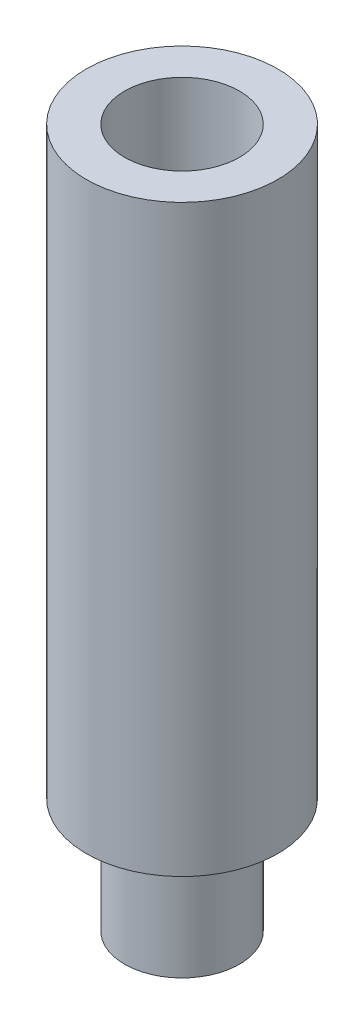
ISO-10303-21;
HEADER;
FILE_DESCRIPTION(('STEP AP214'),'2;1');
FILE_NAME('part.step','',(''),(''),'','','');
FILE_SCHEMA(('AUTOMOTIVE_DESIGN { 1 0 10303 214 1 1 1 1 }'));
ENDSEC;
DATA;
#1=APPLICATION_CONTEXT('core data for automotive mechanical design processes');
#2=APPLICATION_PROTOCOL_DEFINITION('international standard','automotive_design',2000,#1);
#3=PRODUCT_CONTEXT('',#1,'mechanical');
#4=PRODUCT('Part','Part','',(#3));
#5=PRODUCT_RELATED_PRODUCT_CATEGORY('part','',(#4));
#6=PRODUCT_DEFINITION_FORMATION('','',#4);
#7=PRODUCT_DEFINITION_CONTEXT('part definition',#1,'design');
#8=PRODUCT_DEFINITION('design','',#6,#7);
#9=PRODUCT_DEFINITION_SHAPE('','',#8);
#10=(LENGTH_UNIT() NAMED_UNIT(*) SI_UNIT(.MILLI.,.METRE.));
#11=(NAMED_UNIT(*) PLANE_ANGLE_UNIT() SI_UNIT($,.RADIAN.));
#12=(NAMED_UNIT(*) SI_UNIT($,.STERADIAN.) SOLID_ANGLE_UNIT());
#13=UNCERTAINTY_MEASURE_WITH_UNIT(LENGTH_MEASURE(1.E-05),#10,'distance_accuracy_value','');
#14=(GEOMETRIC_REPRESENTATION_CONTEXT(3) GLOBAL_UNCERTAINTY_ASSIGNED_CONTEXT((#13)) GLOBAL_UNIT_ASSIGNED_CONTEXT((#10,
#11,#12)) REPRESENTATION_CONTEXT('',''));
#15=CARTESIAN_POINT('',(0.,0.,0.));
#16=DIRECTION('',(0.,0.,1.));
#17=DIRECTION('',(1.,0.,0.));
#18=AXIS2_PLACEMENT_3D('',#15,#16,#17);
#19=CARTESIAN_POINT('',(-2.5,18.24,0.));
#20=DIRECTION('',(0.,1.,0.));
#21=DIRECTION('',(-1.,0.,0.));
#22=AXIS2_PLACEMENT_3D('',#19,#20,#21);
#23=PLANE('',#22);
#24=CARTESIAN_POINT('',(0.,18.24,0.));
#25=DIRECTION('',(0.,1.,0.));
#26=DIRECTION('',(-1.,0.,0.));
#27=AXIS2_PLACEMENT_3D('',#24,#25,#26);
#28=CIRCLE('',#27,2.5);
#29=CARTESIAN_POINT('',(-2.5,18.24,0.));
#30=VERTEX_POINT('',#29);
#31=EDGE_CURVE('E59',#30,#30,#28,.T.);
#32=ORIENTED_EDGE('',*,*,#31,.T.);
#33=EDGE_LOOP('',(#32));
#34=FACE_BOUND('',#33,.T.);
#35=CARTESIAN_POINT('',(0.,18.24,0.));
#36=DIRECTION('',(0.,1.,0.));
#37=DIRECTION('',(-1.,0.,0.));
#38=AXIS2_PLACEMENT_3D('',#35,#36,#37);
#39=CIRCLE('',#38,1.5);
#40=CARTESIAN_POINT('',(-1.5,18.24,0.));
#41=VERTEX_POINT('',#40);
#42=EDGE_CURVE('E10',#41,#41,#39,.T.);
#43=ORIENTED_EDGE('',*,*,#42,.F.);
#44=EDGE_LOOP('',(#43));
#45=FACE_BOUND('',#44,.T.);
#46=ADVANCED_FACE('F37',(#34,#45),#23,.T.);
#47=CARTESIAN_POINT('',(0.,38.3834867153922,0.));
#48=DIRECTION('',(0.,1.,0.));
#49=DIRECTION('',(-1.,0.,0.));
#50=AXIS2_PLACEMENT_3D('',#47,#48,#49);
#51=CYLINDRICAL_SURFACE('',#50,1.5);
#52=ORIENTED_EDGE('',*,*,#42,.T.);
#53=EDGE_LOOP('',(#52));
#54=FACE_BOUND('',#53,.T.);
#55=CARTESIAN_POINT('',(0.,13.24,0.));
#56=DIRECTION('',(0.,1.,0.));
#57=DIRECTION('',(-1.,0.,0.));
#58=AXIS2_PLACEMENT_3D('',#55,#56,#57);
#59=CIRCLE('',#58,1.5);
#60=CARTESIAN_POINT('',(-1.5,13.24,0.));
#61=VERTEX_POINT('',#60);
#62=EDGE_CURVE('E43',#61,#61,#59,.T.);
#63=ORIENTED_EDGE('',*,*,#62,.F.);
#64=EDGE_LOOP('',(#63));
#65=FACE_BOUND('',#64,.T.);
#66=ADVANCED_FACE('F77',(#54,#65),#51,.F.);
#67=CARTESIAN_POINT('',(-1.5,13.24,0.));
#68=DIRECTION('',(0.,1.,0.));
#69=DIRECTION('',(-1.,0.,0.));
#70=AXIS2_PLACEMENT_3D('',#67,#68,#69);
#71=PLANE('',#70);
#72=ORIENTED_EDGE('',*,*,#62,.T.);
#73=EDGE_LOOP('',(#72));
#74=FACE_BOUND('',#73,.T.);
#75=ADVANCED_FACE('F81',(#74),#71,.T.);
#76=CARTESIAN_POINT('',(-1.49999999999999,0.,0.));
#77=DIRECTION('',(0.,-1.,0.));
#78=DIRECTION('',(1.,0.,0.));
#79=AXIS2_PLACEMENT_3D('',#76,#77,#78);
#80=PLANE('',#79);
#81=CARTESIAN_POINT('',(0.,0.,0.));
#82=DIRECTION('',(0.,1.,0.));
#83=DIRECTION('',(-1.,0.,0.));
#84=AXIS2_PLACEMENT_3D('',#81,#82,#83);
#85=CIRCLE('',#84,1.5);
#86=CARTESIAN_POINT('',(-1.49999999999999,0.,0.));
#87=VERTEX_POINT('',#86);
#88=EDGE_CURVE('E47',#87,#87,#85,.T.);
#89=ORIENTED_EDGE('',*,*,#88,.F.);
#90=EDGE_LOOP('',(#89));
#91=FACE_BOUND('',#90,.T.);
#92=ADVANCED_FACE('F85',(#91),#80,.T.);
#93=CARTESIAN_POINT('',(0.,38.3834867153922,0.));
#94=DIRECTION('',(0.,1.,0.));
#95=DIRECTION('',(-1.,0.,0.));
#96=AXIS2_PLACEMENT_3D('',#93,#94,#95);
#97=CYLINDRICAL_SURFACE('',#96,1.5);
#98=ORIENTED_EDGE('',*,*,#88,.T.);
#99=EDGE_LOOP('',(#98));
#100=FACE_BOUND('',#99,.T.);
#101=CARTESIAN_POINT('',(0.,3.,0.));
#102=DIRECTION('',(0.,1.,0.));
#103=DIRECTION('',(-1.,0.,0.));
#104=AXIS2_PLACEMENT_3D('',#101,#102,#103);
#105=CIRCLE('',#104,1.50000000000001);
#106=CARTESIAN_POINT('',(-1.5,3.,0.));
#107=VERTEX_POINT('',#106);
#108=EDGE_CURVE('E51',#107,#107,#105,.T.);
#109=ORIENTED_EDGE('',*,*,#108,.F.);
#110=EDGE_LOOP('',(#109));
#111=FACE_BOUND('',#110,.T.);
#112=ADVANCED_FACE('F73',(#100,#111),#97,.T.);
#113=CARTESIAN_POINT('',(-2.5,3.,0.));
#114=DIRECTION('',(0.,-1.,0.));
#115=DIRECTION('',(1.,0.,0.));
#116=AXIS2_PLACEMENT_3D('',#113,#114,#115);
#117=PLANE('',#116);
#118=ORIENTED_EDGE('',*,*,#108,.T.);
#119=EDGE_LOOP('',(#118));
#120=FACE_BOUND('',#119,.T.);
#121=CARTESIAN_POINT('',(0.,3.,0.));
#122=DIRECTION('',(0.,1.,0.));
#123=DIRECTION('',(-1.,0.,0.));
#124=AXIS2_PLACEMENT_3D('',#121,#122,#123);
#125=CIRCLE('',#124,2.5);
#126=CARTESIAN_POINT('',(-2.5,3.,0.));
#127=VERTEX_POINT('',#126);
#128=EDGE_CURVE('E56',#127,#127,#125,.T.);
#129=ORIENTED_EDGE('',*,*,#128,.F.);
#130=EDGE_LOOP('',(#129));
#131=FACE_BOUND('',#130,.T.);
#132=ADVANCED_FACE('F67',(#120,#131),#117,.T.);
#133=CARTESIAN_POINT('',(0.,38.3834867153922,0.));
#134=DIRECTION('',(0.,1.,0.));
#135=DIRECTION('',(-1.,0.,0.));
#136=AXIS2_PLACEMENT_3D('',#133,#134,#135);
#137=CYLINDRICAL_SURFACE('',#136,2.5);
#138=ORIENTED_EDGE('',*,*,#128,.T.);
#139=EDGE_LOOP('',(#138));
#140=FACE_BOUND('',#139,.T.);
#141=ORIENTED_EDGE('',*,*,#31,.F.);
#142=EDGE_LOOP('',(#141));
#143=FACE_BOUND('',#142,.T.);
#144=ADVANCED_FACE('F65',(#140,#143),#137,.T.);
#145=CLOSED_SHELL('',(#46,#66,#75,#92,#112,#132,#144));
#146=MANIFOLD_SOLID_BREP('B2',#145);
#147=ADVANCED_BREP_SHAPE_REPRESENTATION('',(#18,#146),#14);
#148=SHAPE_DEFINITION_REPRESENTATION(#9,#147);
ENDSEC;
END-ISO-10303-21;
